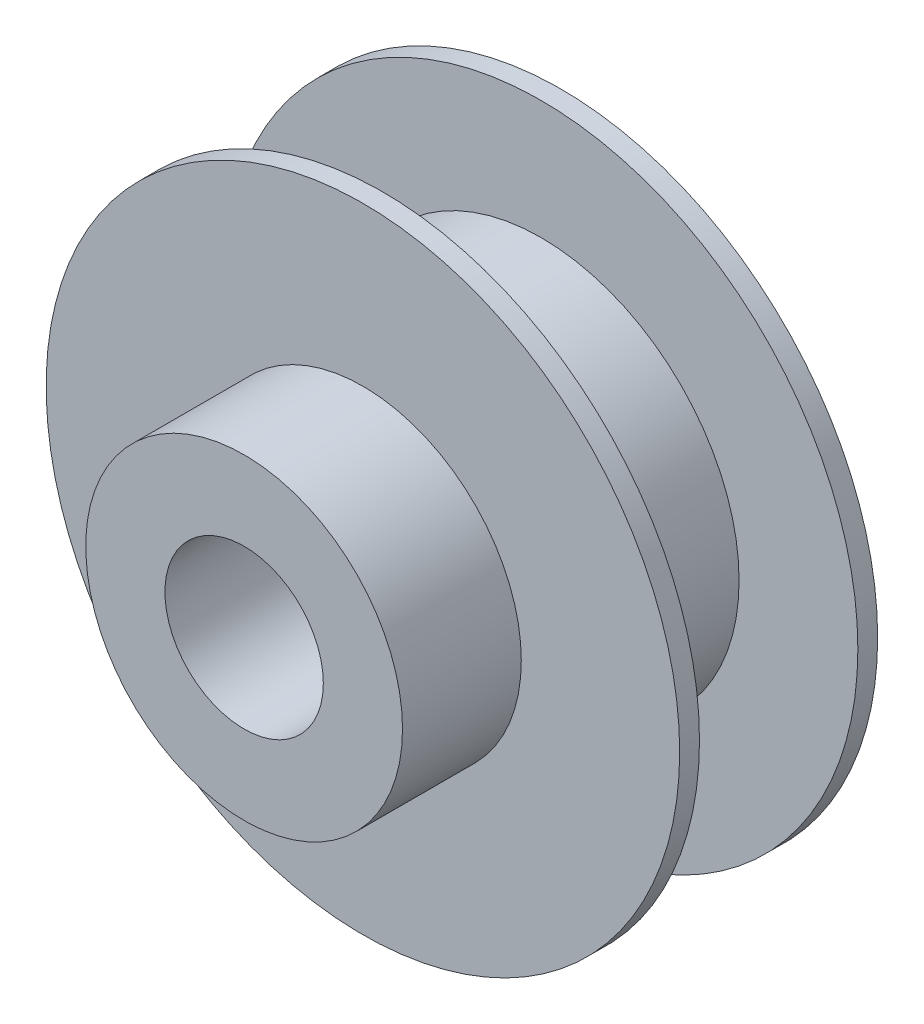
ISO-10303-21;
HEADER;
FILE_DESCRIPTION(('STEP AP214'),'2;1');
FILE_NAME('part.step','',(''),(''),'','','');
FILE_SCHEMA(('AUTOMOTIVE_DESIGN { 1 0 10303 214 1 1 1 1 }'));
ENDSEC;
DATA;
#1=APPLICATION_CONTEXT('core data for automotive mechanical design processes');
#2=APPLICATION_PROTOCOL_DEFINITION('international standard','automotive_design',2000,#1);
#3=PRODUCT_CONTEXT('',#1,'mechanical');
#4=PRODUCT('Part','Part','',(#3));
#5=PRODUCT_RELATED_PRODUCT_CATEGORY('part','',(#4));
#6=PRODUCT_DEFINITION_FORMATION('','',#4);
#7=PRODUCT_DEFINITION_CONTEXT('part definition',#1,'design');
#8=PRODUCT_DEFINITION('design','',#6,#7);
#9=PRODUCT_DEFINITION_SHAPE('','',#8);
#10=(LENGTH_UNIT() NAMED_UNIT(*) SI_UNIT(.MILLI.,.METRE.));
#11=(NAMED_UNIT(*) PLANE_ANGLE_UNIT() SI_UNIT($,.RADIAN.));
#12=(NAMED_UNIT(*) SI_UNIT($,.STERADIAN.) SOLID_ANGLE_UNIT());
#13=UNCERTAINTY_MEASURE_WITH_UNIT(LENGTH_MEASURE(1.E-05),#10,'distance_accuracy_value','');
#14=(GEOMETRIC_REPRESENTATION_CONTEXT(3) GLOBAL_UNCERTAINTY_ASSIGNED_CONTEXT((#13)) GLOBAL_UNIT_ASSIGNED_CONTEXT((#10,
#11,#12)) REPRESENTATION_CONTEXT('',''));
#15=CARTESIAN_POINT('',(0.,0.,0.));
#16=DIRECTION('',(0.,0.,1.));
#17=DIRECTION('',(1.,0.,0.));
#18=AXIS2_PLACEMENT_3D('',#15,#16,#17);
#19=CARTESIAN_POINT('',(0.,0.,10.));
#20=DIRECTION('',(0.,0.,-1.));
#21=DIRECTION('',(-1.,0.,0.));
#22=AXIS2_PLACEMENT_3D('',#19,#20,#21);
#23=CYLINDRICAL_SURFACE('',#22,16.);
#24=CARTESIAN_POINT('',(0.,0.,10.));
#25=DIRECTION('',(0.,0.,1.));
#26=DIRECTION('',(1.,0.,0.));
#27=AXIS2_PLACEMENT_3D('',#24,#25,#26);
#28=CIRCLE('',#27,16.);
#29=CARTESIAN_POINT('',(16.,0.,10.));
#30=VERTEX_POINT('',#29);
#31=EDGE_CURVE('E37',#30,#30,#28,.T.);
#32=ORIENTED_EDGE('',*,*,#31,.F.);
#33=EDGE_LOOP('',(#32));
#34=FACE_BOUND('',#33,.T.);
#35=CARTESIAN_POINT('',(0.,0.,9.));
#36=DIRECTION('',(0.,0.,1.));
#37=DIRECTION('',(1.,0.,0.));
#38=AXIS2_PLACEMENT_3D('',#35,#36,#37);
#39=CIRCLE('',#38,16.);
#40=CARTESIAN_POINT('',(16.,0.,9.));
#41=VERTEX_POINT('',#40);
#42=EDGE_CURVE('E61',#41,#41,#39,.T.);
#43=ORIENTED_EDGE('',*,*,#42,.T.);
#44=EDGE_LOOP('',(#43));
#45=FACE_BOUND('',#44,.T.);
#46=ADVANCED_FACE('F30',(#34,#45),#23,.T.);
#47=CARTESIAN_POINT('',(0.,0.,0.));
#48=DIRECTION('',(0.,0.,1.));
#49=DIRECTION('',(1.,0.,0.));
#50=AXIS2_PLACEMENT_3D('',#47,#48,#49);
#51=CIRCLE('',#50,16.);
#52=CARTESIAN_POINT('',(16.,0.,0.));
#53=VERTEX_POINT('',#52);
#54=EDGE_CURVE('E33',#53,#53,#51,.T.);
#55=ORIENTED_EDGE('',*,*,#54,.T.);
#56=EDGE_LOOP('',(#55));
#57=FACE_BOUND('',#56,.T.);
#58=CARTESIAN_POINT('',(0.,0.,1.));
#59=DIRECTION('',(0.,0.,1.));
#60=DIRECTION('',(1.,0.,0.));
#61=AXIS2_PLACEMENT_3D('',#58,#59,#60);
#62=CIRCLE('',#61,16.);
#63=CARTESIAN_POINT('',(16.,0.,1.));
#64=VERTEX_POINT('',#63);
#65=EDGE_CURVE('E58',#64,#64,#62,.T.);
#66=ORIENTED_EDGE('',*,*,#65,.F.);
#67=EDGE_LOOP('',(#66));
#68=FACE_BOUND('',#67,.T.);
#69=ADVANCED_FACE('F83',(#57,#68),#23,.T.);
#70=CARTESIAN_POINT('',(0.,0.,10.));
#71=DIRECTION('',(0.,0.,1.));
#72=DIRECTION('',(1.,0.,0.));
#73=AXIS2_PLACEMENT_3D('',#70,#71,#72);
#74=PLANE('',#73);
#75=CARTESIAN_POINT('',(0.,0.,10.));
#76=DIRECTION('',(0.,0.,1.));
#77=DIRECTION('',(1.,0.,0.));
#78=AXIS2_PLACEMENT_3D('',#75,#76,#77);
#79=CIRCLE('',#78,8.);
#80=CARTESIAN_POINT('',(8.,0.,10.));
#81=VERTEX_POINT('',#80);
#82=EDGE_CURVE('E10',#81,#81,#79,.T.);
#83=ORIENTED_EDGE('',*,*,#82,.F.);
#84=EDGE_LOOP('',(#83));
#85=FACE_BOUND('',#84,.T.);
#86=ORIENTED_EDGE('',*,*,#31,.T.);
#87=EDGE_LOOP('',(#86));
#88=FACE_BOUND('',#87,.T.);
#89=ADVANCED_FACE('F88',(#85,#88),#74,.T.);
#90=CARTESIAN_POINT('',(0.,0.,0.));
#91=DIRECTION('',(0.,0.,1.));
#92=DIRECTION('',(1.,0.,0.));
#93=AXIS2_PLACEMENT_3D('',#90,#91,#92);
#94=PLANE('',#93);
#95=CARTESIAN_POINT('',(0.,0.,0.));
#96=DIRECTION('',(0.,0.,1.));
#97=DIRECTION('',(1.,0.,0.));
#98=AXIS2_PLACEMENT_3D('',#95,#96,#97);
#99=CIRCLE('',#98,4.);
#100=CARTESIAN_POINT('',(4.,0.,0.));
#101=VERTEX_POINT('',#100);
#102=EDGE_CURVE('E46',#101,#101,#99,.T.);
#103=ORIENTED_EDGE('',*,*,#102,.T.);
#104=EDGE_LOOP('',(#103));
#105=FACE_BOUND('',#104,.T.);
#106=ORIENTED_EDGE('',*,*,#54,.F.);
#107=EDGE_LOOP('',(#106));
#108=FACE_BOUND('',#107,.T.);
#109=ADVANCED_FACE('F93',(#105,#108),#94,.F.);
#110=CARTESIAN_POINT('',(0.,0.,16.));
#111=DIRECTION('',(0.,0.,-1.));
#112=DIRECTION('',(-1.,0.,0.));
#113=AXIS2_PLACEMENT_3D('',#110,#111,#112);
#114=CYLINDRICAL_SURFACE('',#113,8.);
#115=CARTESIAN_POINT('',(0.,0.,16.));
#116=DIRECTION('',(0.,0.,1.));
#117=DIRECTION('',(1.,0.,0.));
#118=AXIS2_PLACEMENT_3D('',#115,#116,#117);
#119=CIRCLE('',#118,8.);
#120=CARTESIAN_POINT('',(8.,0.,16.));
#121=VERTEX_POINT('',#120);
#122=EDGE_CURVE('E43',#121,#121,#119,.T.);
#123=ORIENTED_EDGE('',*,*,#122,.F.);
#124=EDGE_LOOP('',(#123));
#125=FACE_BOUND('',#124,.T.);
#126=ORIENTED_EDGE('',*,*,#82,.T.);
#127=EDGE_LOOP('',(#126));
#128=FACE_BOUND('',#127,.T.);
#129=ADVANCED_FACE('F99',(#125,#128),#114,.T.);
#130=CARTESIAN_POINT('',(0.,0.,16.));
#131=DIRECTION('',(0.,0.,1.));
#132=DIRECTION('',(1.,0.,0.));
#133=AXIS2_PLACEMENT_3D('',#130,#131,#132);
#134=PLANE('',#133);
#135=CARTESIAN_POINT('',(0.,0.,16.));
#136=DIRECTION('',(0.,0.,1.));
#137=DIRECTION('',(1.,0.,0.));
#138=AXIS2_PLACEMENT_3D('',#135,#136,#137);
#139=CIRCLE('',#138,4.);
#140=CARTESIAN_POINT('',(4.,0.,16.));
#141=VERTEX_POINT('',#140);
#142=EDGE_CURVE('E47',#141,#141,#139,.T.);
#143=ORIENTED_EDGE('',*,*,#142,.F.);
#144=EDGE_LOOP('',(#143));
#145=FACE_BOUND('',#144,.T.);
#146=ORIENTED_EDGE('',*,*,#122,.T.);
#147=EDGE_LOOP('',(#146));
#148=FACE_BOUND('',#147,.T.);
#149=ADVANCED_FACE('F79',(#145,#148),#134,.T.);
#150=CARTESIAN_POINT('',(0.,0.,0.));
#151=DIRECTION('',(0.,0.,1.));
#152=DIRECTION('',(1.,0.,0.));
#153=AXIS2_PLACEMENT_3D('',#150,#151,#152);
#154=CYLINDRICAL_SURFACE('',#153,4.);
#155=ORIENTED_EDGE('',*,*,#102,.F.);
#156=EDGE_LOOP('',(#155));
#157=FACE_BOUND('',#156,.T.);
#158=ORIENTED_EDGE('',*,*,#142,.T.);
#159=EDGE_LOOP('',(#158));
#160=FACE_BOUND('',#159,.T.);
#161=ADVANCED_FACE('F69',(#157,#160),#154,.F.);
#162=CARTESIAN_POINT('',(0.,16.,9.));
#163=DIRECTION('',(0.,0.,-1.));
#164=DIRECTION('',(-1.,0.,0.));
#165=AXIS2_PLACEMENT_3D('',#162,#163,#164);
#166=PLANE('',#165);
#167=CARTESIAN_POINT('',(0.,0.,9.));
#168=DIRECTION('',(0.,0.,1.));
#169=DIRECTION('',(1.,0.,0.));
#170=AXIS2_PLACEMENT_3D('',#167,#168,#169);
#171=CIRCLE('',#170,10.);
#172=CARTESIAN_POINT('',(10.,0.,9.));
#173=VERTEX_POINT('',#172);
#174=EDGE_CURVE('E50',#173,#173,#171,.T.);
#175=ORIENTED_EDGE('',*,*,#174,.T.);
#176=EDGE_LOOP('',(#175));
#177=FACE_BOUND('',#176,.T.);
#178=ORIENTED_EDGE('',*,*,#42,.F.);
#179=EDGE_LOOP('',(#178));
#180=FACE_BOUND('',#179,.T.);
#181=ADVANCED_FACE('F66',(#177,#180),#166,.T.);
#182=CARTESIAN_POINT('',(0.,0.,0.));
#183=DIRECTION('',(0.,0.,1.));
#184=DIRECTION('',(1.,0.,0.));
#185=AXIS2_PLACEMENT_3D('',#182,#183,#184);
#186=CYLINDRICAL_SURFACE('',#185,10.);
#187=CARTESIAN_POINT('',(0.,0.,0.999999999999999));
#188=DIRECTION('',(0.,0.,1.));
#189=DIRECTION('',(1.,0.,0.));
#190=AXIS2_PLACEMENT_3D('',#187,#188,#189);
#191=CIRCLE('',#190,10.);
#192=CARTESIAN_POINT('',(10.,0.,0.999999999999999));
#193=VERTEX_POINT('',#192);
#194=EDGE_CURVE('E55',#193,#193,#191,.T.);
#195=ORIENTED_EDGE('',*,*,#194,.T.);
#196=EDGE_LOOP('',(#195));
#197=FACE_BOUND('',#196,.T.);
#198=ORIENTED_EDGE('',*,*,#174,.F.);
#199=EDGE_LOOP('',(#198));
#200=FACE_BOUND('',#199,.T.);
#201=ADVANCED_FACE('F68',(#197,#200),#186,.T.);
#202=CARTESIAN_POINT('',(0.,16.,1.));
#203=DIRECTION('',(0.,0.,1.));
#204=DIRECTION('',(1.,0.,0.));
#205=AXIS2_PLACEMENT_3D('',#202,#203,#204);
#206=PLANE('',#205);
#207=ORIENTED_EDGE('',*,*,#65,.T.);
#208=EDGE_LOOP('',(#207));
#209=FACE_BOUND('',#208,.T.);
#210=ORIENTED_EDGE('',*,*,#194,.F.);
#211=EDGE_LOOP('',(#210));
#212=FACE_BOUND('',#211,.T.);
#213=ADVANCED_FACE('F76',(#209,#212),#206,.T.);
#214=CLOSED_SHELL('',(#46,#69,#89,#109,#129,#149,#161,#181,#201,#213));
#215=MANIFOLD_SOLID_BREP('B2',#214);
#216=ADVANCED_BREP_SHAPE_REPRESENTATION('',(#18,#215),#14);
#217=SHAPE_DEFINITION_REPRESENTATION(#9,#216);
ENDSEC;
END-ISO-10303-21;
